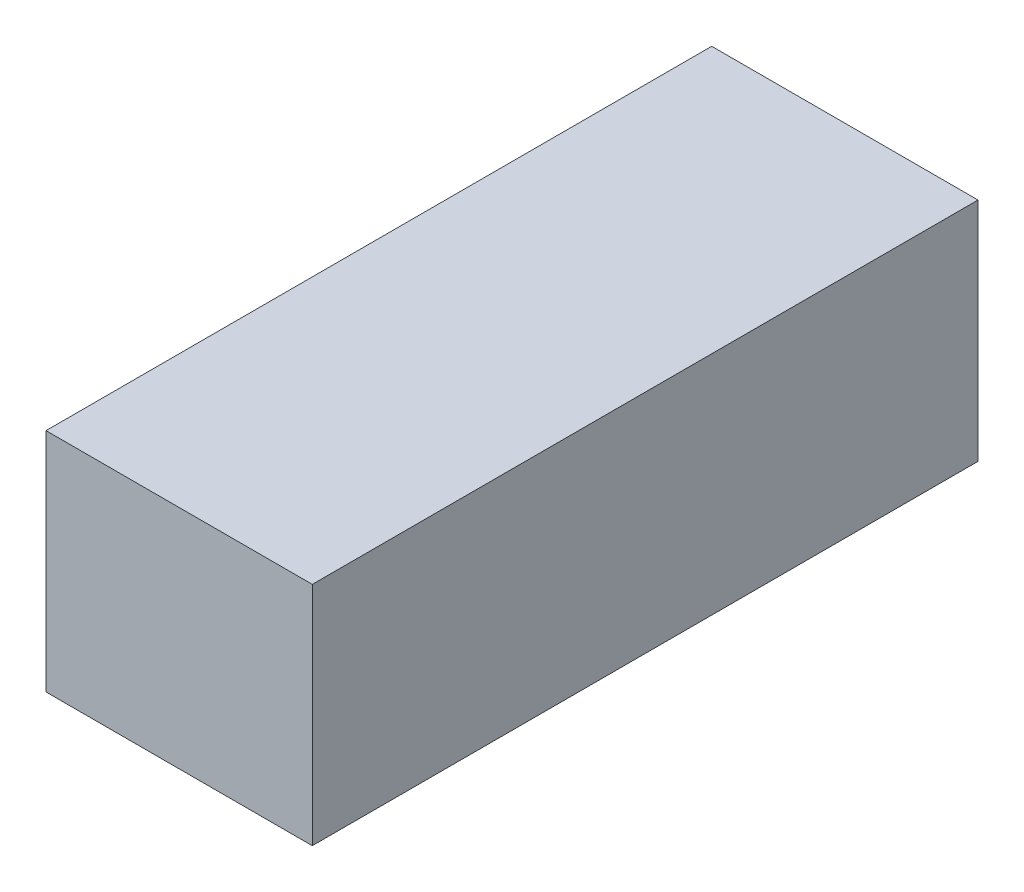
ISO-10303-21;
HEADER;
FILE_DESCRIPTION(('STEP AP214'),'2;1');
FILE_NAME('part.step','',(''),(''),'','','');
FILE_SCHEMA(('AUTOMOTIVE_DESIGN { 1 0 10303 214 1 1 1 1 }'));
ENDSEC;
DATA;
#1=APPLICATION_CONTEXT('core data for automotive mechanical design processes');
#2=APPLICATION_PROTOCOL_DEFINITION('international standard','automotive_design',2000,#1);
#3=PRODUCT_CONTEXT('',#1,'mechanical');
#4=PRODUCT('Part','Part','',(#3));
#5=PRODUCT_RELATED_PRODUCT_CATEGORY('part','',(#4));
#6=PRODUCT_DEFINITION_FORMATION('','',#4);
#7=PRODUCT_DEFINITION_CONTEXT('part definition',#1,'design');
#8=PRODUCT_DEFINITION('design','',#6,#7);
#9=PRODUCT_DEFINITION_SHAPE('','',#8);
#10=(LENGTH_UNIT() NAMED_UNIT(*) SI_UNIT(.MILLI.,.METRE.));
#11=(NAMED_UNIT(*) PLANE_ANGLE_UNIT() SI_UNIT($,.RADIAN.));
#12=(NAMED_UNIT(*) SI_UNIT($,.STERADIAN.) SOLID_ANGLE_UNIT());
#13=UNCERTAINTY_MEASURE_WITH_UNIT(LENGTH_MEASURE(1.E-05),#10,'distance_accuracy_value','');
#14=(GEOMETRIC_REPRESENTATION_CONTEXT(3) GLOBAL_UNCERTAINTY_ASSIGNED_CONTEXT((#13)) GLOBAL_UNIT_ASSIGNED_CONTEXT((#10,
#11,#12)) REPRESENTATION_CONTEXT('',''));
#15=CARTESIAN_POINT('',(0.,0.,0.));
#16=DIRECTION('',(0.,0.,1.));
#17=DIRECTION('',(1.,0.,0.));
#18=AXIS2_PLACEMENT_3D('',#15,#16,#17);
#19=CARTESIAN_POINT('',(0.,17.,0.));
#20=DIRECTION('',(1.,0.,0.));
#21=DIRECTION('',(0.,0.,-1.));
#22=AXIS2_PLACEMENT_3D('',#19,#20,#21);
#23=PLANE('',#22);
#24=DIRECTION('',(0.,0.,1.));
#25=VECTOR('',#24,1.);
#26=CARTESIAN_POINT('',(0.,0.,0.));
#27=LINE('',#26,#25);
#28=CARTESIAN_POINT('',(0.,0.,-50.));
#29=VERTEX_POINT('',#28);
#30=CARTESIAN_POINT('',(0.,0.,0.));
#31=VERTEX_POINT('',#30);
#32=EDGE_CURVE('E113',#29,#31,#27,.T.);
#33=ORIENTED_EDGE('',*,*,#32,.T.);
#34=DIRECTION('',(0.,-1.,0.));
#35=VECTOR('',#34,1.);
#36=CARTESIAN_POINT('',(0.,17.,0.));
#37=LINE('',#36,#35);
#38=CARTESIAN_POINT('',(0.,17.,0.));
#39=VERTEX_POINT('',#38);
#40=EDGE_CURVE('E11',#39,#31,#37,.T.);
#41=ORIENTED_EDGE('',*,*,#40,.F.);
#42=DIRECTION('',(0.,0.,1.));
#43=VECTOR('',#42,1.);
#44=CARTESIAN_POINT('',(0.,17.,0.));
#45=LINE('',#44,#43);
#46=CARTESIAN_POINT('',(0.,17.,-50.));
#47=VERTEX_POINT('',#46);
#48=EDGE_CURVE('E97',#47,#39,#45,.T.);
#49=ORIENTED_EDGE('',*,*,#48,.F.);
#50=DIRECTION('',(0.,-1.,0.));
#51=VECTOR('',#50,1.);
#52=CARTESIAN_POINT('',(0.,17.,-50.));
#53=LINE('',#52,#51);
#54=EDGE_CURVE('E109',#47,#29,#53,.T.);
#55=ORIENTED_EDGE('',*,*,#54,.T.);
#56=EDGE_LOOP('',(#33,#41,#49,#55));
#57=FACE_BOUND('',#56,.T.);
#58=ADVANCED_FACE('F45',(#57),#23,.F.);
#59=CARTESIAN_POINT('',(0.,17.,0.));
#60=DIRECTION('',(0.,0.,-1.));
#61=DIRECTION('',(-1.,0.,0.));
#62=AXIS2_PLACEMENT_3D('',#59,#60,#61);
#63=PLANE('',#62);
#64=DIRECTION('',(1.,0.,0.));
#65=VECTOR('',#64,1.);
#66=CARTESIAN_POINT('',(0.,0.,0.));
#67=LINE('',#66,#65);
#68=CARTESIAN_POINT('',(20.,0.,0.));
#69=VERTEX_POINT('',#68);
#70=EDGE_CURVE('E102',#31,#69,#67,.T.);
#71=ORIENTED_EDGE('',*,*,#70,.T.);
#72=DIRECTION('',(0.,-1.,0.));
#73=VECTOR('',#72,1.);
#74=CARTESIAN_POINT('',(20.,17.,0.));
#75=LINE('',#74,#73);
#76=CARTESIAN_POINT('',(20.,17.,0.));
#77=VERTEX_POINT('',#76);
#78=EDGE_CURVE('E54',#77,#69,#75,.T.);
#79=ORIENTED_EDGE('',*,*,#78,.F.);
#80=DIRECTION('',(1.,0.,0.));
#81=VECTOR('',#80,1.);
#82=CARTESIAN_POINT('',(0.,17.,0.));
#83=LINE('',#82,#81);
#84=EDGE_CURVE('E92',#39,#77,#83,.T.);
#85=ORIENTED_EDGE('',*,*,#84,.F.);
#86=ORIENTED_EDGE('',*,*,#40,.T.);
#87=EDGE_LOOP('',(#71,#79,#85,#86));
#88=FACE_BOUND('',#87,.T.);
#89=ADVANCED_FACE('F101',(#88),#63,.F.);
#90=CARTESIAN_POINT('',(20.,17.,0.));
#91=DIRECTION('',(-1.,0.,0.));
#92=DIRECTION('',(0.,0.,1.));
#93=AXIS2_PLACEMENT_3D('',#90,#91,#92);
#94=PLANE('',#93);
#95=DIRECTION('',(0.,0.,-1.));
#96=VECTOR('',#95,1.);
#97=CARTESIAN_POINT('',(20.,0.,0.));
#98=LINE('',#97,#96);
#99=CARTESIAN_POINT('',(20.,0.,-50.));
#100=VERTEX_POINT('',#99);
#101=EDGE_CURVE('E79',#69,#100,#98,.T.);
#102=ORIENTED_EDGE('',*,*,#101,.T.);
#103=DIRECTION('',(0.,-1.,0.));
#104=VECTOR('',#103,1.);
#105=CARTESIAN_POINT('',(20.,17.,-50.));
#106=LINE('',#105,#104);
#107=CARTESIAN_POINT('',(20.,17.,-50.));
#108=VERTEX_POINT('',#107);
#109=EDGE_CURVE('E104',#108,#100,#106,.T.);
#110=ORIENTED_EDGE('',*,*,#109,.F.);
#111=DIRECTION('',(0.,0.,-1.));
#112=VECTOR('',#111,1.);
#113=CARTESIAN_POINT('',(20.,17.,0.));
#114=LINE('',#113,#112);
#115=EDGE_CURVE('E95',#77,#108,#114,.T.);
#116=ORIENTED_EDGE('',*,*,#115,.F.);
#117=ORIENTED_EDGE('',*,*,#78,.T.);
#118=EDGE_LOOP('',(#102,#110,#116,#117));
#119=FACE_BOUND('',#118,.T.);
#120=ADVANCED_FACE('F105',(#119),#94,.F.);
#121=CARTESIAN_POINT('',(0.,17.,-50.));
#122=DIRECTION('',(0.,0.,1.));
#123=DIRECTION('',(1.,0.,0.));
#124=AXIS2_PLACEMENT_3D('',#121,#122,#123);
#125=PLANE('',#124);
#126=DIRECTION('',(-1.,0.,0.));
#127=VECTOR('',#126,1.);
#128=CARTESIAN_POINT('',(0.,0.,-50.));
#129=LINE('',#128,#127);
#130=EDGE_CURVE('E85',#100,#29,#129,.T.);
#131=ORIENTED_EDGE('',*,*,#130,.T.);
#132=ORIENTED_EDGE('',*,*,#54,.F.);
#133=DIRECTION('',(-1.,0.,0.));
#134=VECTOR('',#133,1.);
#135=CARTESIAN_POINT('',(0.,17.,-50.));
#136=LINE('',#135,#134);
#137=EDGE_CURVE('E62',#108,#47,#136,.T.);
#138=ORIENTED_EDGE('',*,*,#137,.F.);
#139=ORIENTED_EDGE('',*,*,#109,.T.);
#140=EDGE_LOOP('',(#131,#132,#138,#139));
#141=FACE_BOUND('',#140,.T.);
#142=ADVANCED_FACE('F126',(#141),#125,.F.);
#143=CARTESIAN_POINT('',(0.,17.,0.));
#144=DIRECTION('',(0.,-1.,0.));
#145=DIRECTION('',(0.,0.,-1.));
#146=AXIS2_PLACEMENT_3D('',#143,#144,#145);
#147=PLANE('',#146);
#148=ORIENTED_EDGE('',*,*,#48,.T.);
#149=ORIENTED_EDGE('',*,*,#84,.T.);
#150=ORIENTED_EDGE('',*,*,#115,.T.);
#151=ORIENTED_EDGE('',*,*,#137,.T.);
#152=EDGE_LOOP('',(#148,#149,#150,#151));
#153=FACE_BOUND('',#152,.T.);
#154=ADVANCED_FACE('F93',(#153),#147,.F.);
#155=CARTESIAN_POINT('',(0.,0.,0.));
#156=DIRECTION('',(0.,-1.,0.));
#157=DIRECTION('',(0.,0.,-1.));
#158=AXIS2_PLACEMENT_3D('',#155,#156,#157);
#159=PLANE('',#158);
#160=ORIENTED_EDGE('',*,*,#32,.F.);
#161=ORIENTED_EDGE('',*,*,#130,.F.);
#162=ORIENTED_EDGE('',*,*,#101,.F.);
#163=ORIENTED_EDGE('',*,*,#70,.F.);
#164=EDGE_LOOP('',(#160,#161,#162,#163));
#165=FACE_BOUND('',#164,.T.);
#166=ADVANCED_FACE('F129',(#165),#159,.T.);
#167=CLOSED_SHELL('',(#58,#89,#120,#142,#154,#166));
#168=MANIFOLD_SOLID_BREP('B2',#167);
#169=ADVANCED_BREP_SHAPE_REPRESENTATION('',(#18,#168),#14);
#170=SHAPE_DEFINITION_REPRESENTATION(#9,#169);
ENDSEC;
END-ISO-10303-21;
